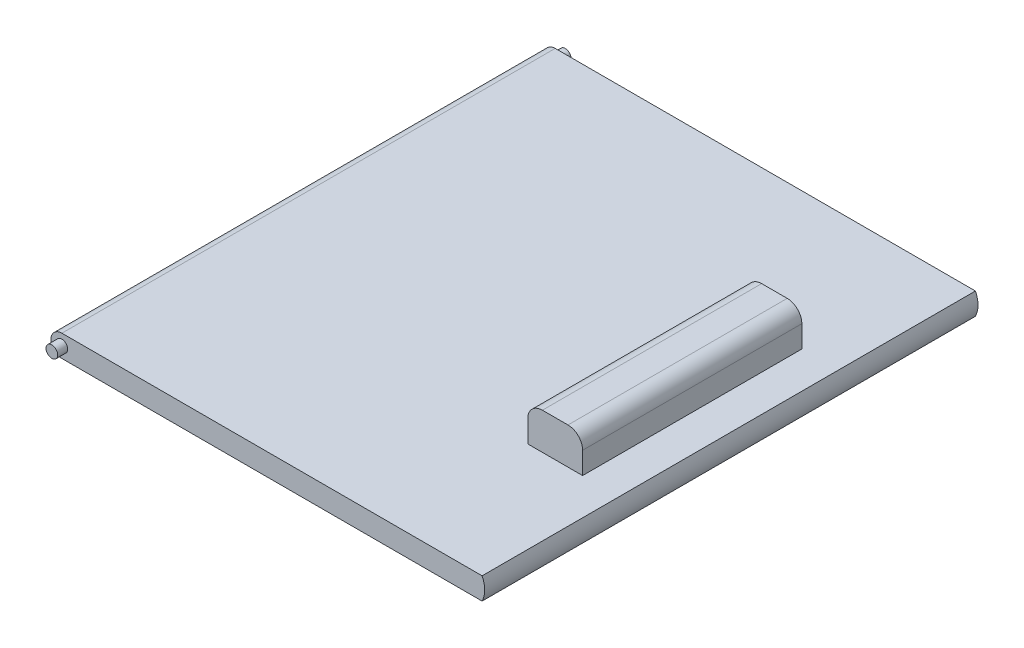
ISO-10303-21;
HEADER;
FILE_DESCRIPTION(('STEP AP214'),'2;1');
FILE_NAME('part.step','',(''),(''),'','','');
FILE_SCHEMA(('AUTOMOTIVE_DESIGN { 1 0 10303 214 1 1 1 1 }'));
ENDSEC;
DATA;
#1=APPLICATION_CONTEXT('core data for automotive mechanical design processes');
#2=APPLICATION_PROTOCOL_DEFINITION('international standard','automotive_design',2000,#1);
#3=PRODUCT_CONTEXT('',#1,'mechanical');
#4=PRODUCT('Part','Part','',(#3));
#5=PRODUCT_RELATED_PRODUCT_CATEGORY('part','',(#4));
#6=PRODUCT_DEFINITION_FORMATION('','',#4);
#7=PRODUCT_DEFINITION_CONTEXT('part definition',#1,'design');
#8=PRODUCT_DEFINITION('design','',#6,#7);
#9=PRODUCT_DEFINITION_SHAPE('','',#8);
#10=(LENGTH_UNIT() NAMED_UNIT(*) SI_UNIT(.MILLI.,.METRE.));
#11=(NAMED_UNIT(*) PLANE_ANGLE_UNIT() SI_UNIT($,.RADIAN.));
#12=(NAMED_UNIT(*) SI_UNIT($,.STERADIAN.) SOLID_ANGLE_UNIT());
#13=UNCERTAINTY_MEASURE_WITH_UNIT(LENGTH_MEASURE(1.E-05),#10,'distance_accuracy_value','');
#14=(GEOMETRIC_REPRESENTATION_CONTEXT(3) GLOBAL_UNCERTAINTY_ASSIGNED_CONTEXT((#13)) GLOBAL_UNIT_ASSIGNED_CONTEXT((#10,
#11,#12)) REPRESENTATION_CONTEXT('',''));
#15=CARTESIAN_POINT('',(0.,0.,0.));
#16=DIRECTION('',(0.,0.,1.));
#17=DIRECTION('',(1.,0.,0.));
#18=AXIS2_PLACEMENT_3D('',#15,#16,#17);
#19=CARTESIAN_POINT('',(0.,1.5,67.5));
#20=DIRECTION('',(0.,-1.,0.));
#21=DIRECTION('',(0.,0.,-1.));
#22=AXIS2_PLACEMENT_3D('',#19,#20,#21);
#23=PLANE('',#22);
#24=DIRECTION('',(-1.,0.,0.));
#25=VECTOR('',#24,1.);
#26=CARTESIAN_POINT('',(0.,1.5,0.));
#27=LINE('',#26,#25);
#28=CARTESIAN_POINT('',(57.5,1.49999999999999,0.));
#29=VERTEX_POINT('',#28);
#30=CARTESIAN_POINT('',(0.,1.5,0.));
#31=VERTEX_POINT('',#30);
#32=EDGE_CURVE('E159',#29,#31,#27,.T.);
#33=ORIENTED_EDGE('',*,*,#32,.T.);
#34=DIRECTION('',(0.,0.,-1.));
#35=VECTOR('',#34,1.);
#36=CARTESIAN_POINT('',(0.,1.5,67.5));
#37=LINE('',#36,#35);
#38=CARTESIAN_POINT('',(0.,1.5,67.5));
#39=VERTEX_POINT('',#38);
#40=EDGE_CURVE('E179',#39,#31,#37,.T.);
#41=ORIENTED_EDGE('',*,*,#40,.F.);
#42=DIRECTION('',(-1.,0.,0.));
#43=VECTOR('',#42,1.);
#44=CARTESIAN_POINT('',(0.,1.5,67.5));
#45=LINE('',#44,#43);
#46=CARTESIAN_POINT('',(57.5,1.5,67.5));
#47=VERTEX_POINT('',#46);
#48=EDGE_CURVE('E162',#47,#39,#45,.T.);
#49=ORIENTED_EDGE('',*,*,#48,.F.);
#50=DIRECTION('',(0.,0.,-1.));
#51=VECTOR('',#50,1.);
#52=CARTESIAN_POINT('',(57.5,1.5,67.5));
#53=LINE('',#52,#51);
#54=EDGE_CURVE('E182',#47,#29,#53,.T.);
#55=ORIENTED_EDGE('',*,*,#54,.T.);
#56=EDGE_LOOP('',(#33,#41,#49,#55));
#57=FACE_BOUND('',#56,.T.);
#58=DIRECTION('',(0.,0.,1.));
#59=VECTOR('',#58,1.);
#60=CARTESIAN_POINT('',(45.,1.5,18.75));
#61=LINE('',#60,#59);
#62=CARTESIAN_POINT('',(45.,1.5,18.75));
#63=VERTEX_POINT('',#62);
#64=CARTESIAN_POINT('',(45.,1.5,48.75));
#65=VERTEX_POINT('',#64);
#66=EDGE_CURVE('E117',#63,#65,#61,.T.);
#67=ORIENTED_EDGE('',*,*,#66,.F.);
#68=DIRECTION('',(-1.,0.,0.));
#69=VECTOR('',#68,1.);
#70=CARTESIAN_POINT('',(45.,1.5,18.75));
#71=LINE('',#70,#69);
#72=CARTESIAN_POINT('',(52.5,1.5,18.75));
#73=VERTEX_POINT('',#72);
#74=EDGE_CURVE('E127',#73,#63,#71,.T.);
#75=ORIENTED_EDGE('',*,*,#74,.F.);
#76=DIRECTION('',(0.,0.,-1.));
#77=VECTOR('',#76,1.);
#78=CARTESIAN_POINT('',(52.5,1.5,18.75));
#79=LINE('',#78,#77);
#80=CARTESIAN_POINT('',(52.5,1.5,48.75));
#81=VERTEX_POINT('',#80);
#82=EDGE_CURVE('E134',#81,#73,#79,.T.);
#83=ORIENTED_EDGE('',*,*,#82,.F.);
#84=DIRECTION('',(1.,0.,0.));
#85=VECTOR('',#84,1.);
#86=CARTESIAN_POINT('',(45.,1.5,48.75));
#87=LINE('',#86,#85);
#88=EDGE_CURVE('E130',#65,#81,#87,.T.);
#89=ORIENTED_EDGE('',*,*,#88,.F.);
#90=EDGE_LOOP('',(#67,#75,#83,#89));
#91=FACE_BOUND('',#90,.T.);
#92=ADVANCED_FACE('F39',(#57,#91),#23,.F.);
#93=CARTESIAN_POINT('',(0.,0.,67.5));
#94=DIRECTION('',(0.,0.,-1.));
#95=DIRECTION('',(-1.,0.,0.));
#96=AXIS2_PLACEMENT_3D('',#93,#94,#95);
#97=CYLINDRICAL_SURFACE('',#96,1.5);
#98=CARTESIAN_POINT('',(0.,0.,0.));
#99=DIRECTION('',(0.,0.,1.));
#100=DIRECTION('',(1.,0.,0.));
#101=AXIS2_PLACEMENT_3D('',#98,#99,#100);
#102=CIRCLE('',#101,1.5);
#103=CARTESIAN_POINT('',(0.,-1.5,0.));
#104=VERTEX_POINT('',#103);
#105=EDGE_CURVE('E171',#31,#104,#102,.T.);
#106=ORIENTED_EDGE('',*,*,#105,.T.);
#107=DIRECTION('',(0.,0.,-1.));
#108=VECTOR('',#107,1.);
#109=CARTESIAN_POINT('',(0.,-1.5,67.5));
#110=LINE('',#109,#108);
#111=CARTESIAN_POINT('',(0.,-1.5,67.5));
#112=VERTEX_POINT('',#111);
#113=EDGE_CURVE('E176',#112,#104,#110,.T.);
#114=ORIENTED_EDGE('',*,*,#113,.F.);
#115=CARTESIAN_POINT('',(0.,0.,67.5));
#116=DIRECTION('',(0.,0.,1.));
#117=DIRECTION('',(1.,0.,0.));
#118=AXIS2_PLACEMENT_3D('',#115,#116,#117);
#119=CIRCLE('',#118,1.5);
#120=EDGE_CURVE('E164',#39,#112,#119,.T.);
#121=ORIENTED_EDGE('',*,*,#120,.F.);
#122=ORIENTED_EDGE('',*,*,#40,.T.);
#123=EDGE_LOOP('',(#106,#114,#121,#122));
#124=FACE_BOUND('',#123,.T.);
#125=ADVANCED_FACE('F224',(#124),#97,.T.);
#126=CARTESIAN_POINT('',(0.,-1.5,67.5));
#127=DIRECTION('',(0.,1.,0.));
#128=DIRECTION('',(0.,0.,1.));
#129=AXIS2_PLACEMENT_3D('',#126,#127,#128);
#130=PLANE('',#129);
#131=DIRECTION('',(1.,0.,0.));
#132=VECTOR('',#131,1.);
#133=CARTESIAN_POINT('',(0.,-1.5,0.));
#134=LINE('',#133,#132);
#135=CARTESIAN_POINT('',(57.5,-1.5,0.));
#136=VERTEX_POINT('',#135);
#137=EDGE_CURVE('E165',#104,#136,#134,.T.);
#138=ORIENTED_EDGE('',*,*,#137,.T.);
#139=DIRECTION('',(0.,0.,-1.));
#140=VECTOR('',#139,1.);
#141=CARTESIAN_POINT('',(57.5,-1.5,67.5));
#142=LINE('',#141,#140);
#143=CARTESIAN_POINT('',(57.5,-1.5,67.5));
#144=VERTEX_POINT('',#143);
#145=EDGE_CURVE('E169',#144,#136,#142,.T.);
#146=ORIENTED_EDGE('',*,*,#145,.F.);
#147=DIRECTION('',(1.,0.,0.));
#148=VECTOR('',#147,1.);
#149=CARTESIAN_POINT('',(0.,-1.5,67.5));
#150=LINE('',#149,#148);
#151=EDGE_CURVE('E167',#112,#144,#150,.T.);
#152=ORIENTED_EDGE('',*,*,#151,.F.);
#153=ORIENTED_EDGE('',*,*,#113,.T.);
#154=EDGE_LOOP('',(#138,#146,#152,#153));
#155=FACE_BOUND('',#154,.T.);
#156=ADVANCED_FACE('F232',(#155),#130,.F.);
#157=CARTESIAN_POINT('',(0.,0.,67.5));
#158=DIRECTION('',(0.,0.,1.));
#159=DIRECTION('',(1.,0.,0.));
#160=AXIS2_PLACEMENT_3D('',#157,#158,#159);
#161=PLANE('',#160);
#162=CARTESIAN_POINT('',(0.,0.,67.5));
#163=DIRECTION('',(0.,0.,1.));
#164=DIRECTION('',(1.,0.,0.));
#165=AXIS2_PLACEMENT_3D('',#162,#163,#164);
#166=CIRCLE('',#165,0.8);
#167=CARTESIAN_POINT('',(0.8,0.,67.5));
#168=VERTEX_POINT('',#167);
#169=EDGE_CURVE('E155',#168,#168,#166,.T.);
#170=ORIENTED_EDGE('',*,*,#169,.F.);
#171=EDGE_LOOP('',(#170));
#172=FACE_BOUND('',#171,.T.);
#173=ORIENTED_EDGE('',*,*,#151,.T.);
#174=CARTESIAN_POINT('',(54.5,0.,67.5));
#175=DIRECTION('',(0.,0.,1.));
#176=DIRECTION('',(1.,0.,0.));
#177=AXIS2_PLACEMENT_3D('',#174,#175,#176);
#178=CIRCLE('',#177,3.35410196624968);
#179=EDGE_CURVE('E146',#144,#47,#178,.T.);
#180=ORIENTED_EDGE('',*,*,#179,.T.);
#181=ORIENTED_EDGE('',*,*,#48,.T.);
#182=ORIENTED_EDGE('',*,*,#120,.T.);
#183=EDGE_LOOP('',(#173,#180,#181,#182));
#184=FACE_BOUND('',#183,.T.);
#185=ADVANCED_FACE('F293',(#172,#184),#161,.T.);
#186=CARTESIAN_POINT('',(0.,0.,0.));
#187=DIRECTION('',(0.,0.,1.));
#188=DIRECTION('',(1.,0.,0.));
#189=AXIS2_PLACEMENT_3D('',#186,#187,#188);
#190=PLANE('',#189);
#191=CARTESIAN_POINT('',(0.,0.,0.));
#192=DIRECTION('',(0.,0.,1.));
#193=DIRECTION('',(1.,0.,0.));
#194=AXIS2_PLACEMENT_3D('',#191,#192,#193);
#195=CIRCLE('',#194,0.8);
#196=CARTESIAN_POINT('',(0.8,0.,0.));
#197=VERTEX_POINT('',#196);
#198=EDGE_CURVE('E184',#197,#197,#195,.F.);
#199=ORIENTED_EDGE('',*,*,#198,.F.);
#200=EDGE_LOOP('',(#199));
#201=FACE_BOUND('',#200,.T.);
#202=ORIENTED_EDGE('',*,*,#32,.F.);
#203=CARTESIAN_POINT('',(54.5,0.,0.));
#204=DIRECTION('',(0.,0.,1.));
#205=DIRECTION('',(1.,0.,0.));
#206=AXIS2_PLACEMENT_3D('',#203,#204,#205);
#207=CIRCLE('',#206,3.35410196624968);
#208=EDGE_CURVE('E147',#29,#136,#207,.F.);
#209=ORIENTED_EDGE('',*,*,#208,.T.);
#210=ORIENTED_EDGE('',*,*,#137,.F.);
#211=ORIENTED_EDGE('',*,*,#105,.F.);
#212=EDGE_LOOP('',(#202,#209,#210,#211));
#213=FACE_BOUND('',#212,.T.);
#214=ADVANCED_FACE('F287',(#201,#213),#190,.F.);
#215=CARTESIAN_POINT('',(0.,0.,68.875));
#216=DIRECTION('',(0.,0.,-1.));
#217=DIRECTION('',(-1.,0.,0.));
#218=AXIS2_PLACEMENT_3D('',#215,#216,#217);
#219=CYLINDRICAL_SURFACE('',#218,0.8);
#220=CARTESIAN_POINT('',(0.,0.,68.875));
#221=DIRECTION('',(0.,0.,1.));
#222=DIRECTION('',(1.,0.,0.));
#223=AXIS2_PLACEMENT_3D('',#220,#221,#222);
#224=CIRCLE('',#223,0.8);
#225=CARTESIAN_POINT('',(0.8,0.,68.875));
#226=VERTEX_POINT('',#225);
#227=EDGE_CURVE('E156',#226,#226,#224,.T.);
#228=ORIENTED_EDGE('',*,*,#227,.F.);
#229=EDGE_LOOP('',(#228));
#230=FACE_BOUND('',#229,.T.);
#231=ORIENTED_EDGE('',*,*,#169,.T.);
#232=EDGE_LOOP('',(#231));
#233=FACE_BOUND('',#232,.T.);
#234=ADVANCED_FACE('F292',(#230,#233),#219,.T.);
#235=CARTESIAN_POINT('',(0.,0.,68.875));
#236=DIRECTION('',(0.,0.,1.));
#237=DIRECTION('',(1.,0.,0.));
#238=AXIS2_PLACEMENT_3D('',#235,#236,#237);
#239=PLANE('',#238);
#240=ORIENTED_EDGE('',*,*,#227,.T.);
#241=EDGE_LOOP('',(#240));
#242=FACE_BOUND('',#241,.T.);
#243=ADVANCED_FACE('F328',(#242),#239,.T.);
#244=CARTESIAN_POINT('',(0.,0.,-1.375));
#245=DIRECTION('',(0.,0.,1.));
#246=DIRECTION('',(1.,0.,0.));
#247=AXIS2_PLACEMENT_3D('',#244,#245,#246);
#248=CYLINDRICAL_SURFACE('',#247,0.8);
#249=CARTESIAN_POINT('',(0.,0.,-1.375));
#250=DIRECTION('',(0.,0.,-1.));
#251=DIRECTION('',(-1.,0.,0.));
#252=AXIS2_PLACEMENT_3D('',#249,#250,#251);
#253=CIRCLE('',#252,0.8);
#254=CARTESIAN_POINT('',(-0.8,0.,-1.375));
#255=VERTEX_POINT('',#254);
#256=EDGE_CURVE('E150',#255,#255,#253,.T.);
#257=ORIENTED_EDGE('',*,*,#256,.F.);
#258=EDGE_LOOP('',(#257));
#259=FACE_BOUND('',#258,.T.);
#260=ORIENTED_EDGE('',*,*,#198,.T.);
#261=EDGE_LOOP('',(#260));
#262=FACE_BOUND('',#261,.T.);
#263=ADVANCED_FACE('F318',(#259,#262),#248,.T.);
#264=CARTESIAN_POINT('',(0.,0.,-1.375));
#265=DIRECTION('',(0.,0.,-1.));
#266=DIRECTION('',(-1.,0.,0.));
#267=AXIS2_PLACEMENT_3D('',#264,#265,#266);
#268=PLANE('',#267);
#269=ORIENTED_EDGE('',*,*,#256,.T.);
#270=EDGE_LOOP('',(#269));
#271=FACE_BOUND('',#270,.T.);
#272=ADVANCED_FACE('F280',(#271),#268,.T.);
#273=CARTESIAN_POINT('',(54.5,0.,-3.02082574845056));
#274=DIRECTION('',(0.,0.,1.));
#275=DIRECTION('',(1.,0.,0.));
#276=AXIS2_PLACEMENT_3D('',#273,#274,#275);
#277=CYLINDRICAL_SURFACE('',#276,3.35410196624968);
#278=ORIENTED_EDGE('',*,*,#208,.F.);
#279=ORIENTED_EDGE('',*,*,#54,.F.);
#280=ORIENTED_EDGE('',*,*,#179,.F.);
#281=ORIENTED_EDGE('',*,*,#145,.T.);
#282=EDGE_LOOP('',(#278,#279,#280,#281));
#283=FACE_BOUND('',#282,.T.);
#284=ADVANCED_FACE('F268',(#283),#277,.T.);
#285=CARTESIAN_POINT('',(45.,6.5,18.75));
#286=DIRECTION('',(1.,0.,0.));
#287=DIRECTION('',(0.,0.,-1.));
#288=AXIS2_PLACEMENT_3D('',#285,#286,#287);
#289=PLANE('',#288);
#290=DIRECTION('',(0.,-1.,0.));
#291=VECTOR('',#290,1.);
#292=CARTESIAN_POINT('',(45.,6.5,48.75));
#293=LINE('',#292,#291);
#294=CARTESIAN_POINT('',(45.,4.5,48.75));
#295=VERTEX_POINT('',#294);
#296=EDGE_CURVE('E144',#295,#65,#293,.T.);
#297=ORIENTED_EDGE('',*,*,#296,.F.);
#298=DIRECTION('',(0.,0.,1.));
#299=VECTOR('',#298,1.);
#300=CARTESIAN_POINT('',(45.,4.5,18.75));
#301=LINE('',#300,#299);
#302=CARTESIAN_POINT('',(45.,4.5,18.75));
#303=VERTEX_POINT('',#302);
#304=EDGE_CURVE('E62',#295,#303,#301,.F.);
#305=ORIENTED_EDGE('',*,*,#304,.T.);
#306=DIRECTION('',(0.,-1.,0.));
#307=VECTOR('',#306,1.);
#308=CARTESIAN_POINT('',(45.,6.5,18.75));
#309=LINE('',#308,#307);
#310=EDGE_CURVE('E114',#303,#63,#309,.T.);
#311=ORIENTED_EDGE('',*,*,#310,.T.);
#312=ORIENTED_EDGE('',*,*,#66,.T.);
#313=EDGE_LOOP('',(#297,#305,#311,#312));
#314=FACE_BOUND('',#313,.T.);
#315=ADVANCED_FACE('F116',(#314),#289,.F.);
#316=CARTESIAN_POINT('',(45.,6.5,48.75));
#317=DIRECTION('',(0.,0.,-1.));
#318=DIRECTION('',(-1.,0.,0.));
#319=AXIS2_PLACEMENT_3D('',#316,#317,#318);
#320=PLANE('',#319);
#321=DIRECTION('',(1.,0.,0.));
#322=VECTOR('',#321,1.);
#323=CARTESIAN_POINT('',(45.,6.5,48.75));
#324=LINE('',#323,#322);
#325=CARTESIAN_POINT('',(47.,6.5,48.75));
#326=VERTEX_POINT('',#325);
#327=CARTESIAN_POINT('',(50.5,6.5,48.75));
#328=VERTEX_POINT('',#327);
#329=EDGE_CURVE('E133',#326,#328,#324,.T.);
#330=ORIENTED_EDGE('',*,*,#329,.F.);
#331=CARTESIAN_POINT('',(47.,4.5,48.75));
#332=DIRECTION('',(0.,0.,-1.));
#333=DIRECTION('',(-1.,0.,0.));
#334=AXIS2_PLACEMENT_3D('',#331,#332,#333);
#335=CIRCLE('',#334,2.);
#336=EDGE_CURVE('E195',#326,#295,#335,.F.);
#337=ORIENTED_EDGE('',*,*,#336,.T.);
#338=ORIENTED_EDGE('',*,*,#296,.T.);
#339=ORIENTED_EDGE('',*,*,#88,.T.);
#340=DIRECTION('',(0.,-1.,0.));
#341=VECTOR('',#340,1.);
#342=CARTESIAN_POINT('',(52.5,6.5,48.75));
#343=LINE('',#342,#341);
#344=CARTESIAN_POINT('',(52.5,4.5,48.75));
#345=VERTEX_POINT('',#344);
#346=EDGE_CURVE('E142',#345,#81,#343,.T.);
#347=ORIENTED_EDGE('',*,*,#346,.F.);
#348=CARTESIAN_POINT('',(50.5,4.5,48.75));
#349=DIRECTION('',(0.,0.,-1.));
#350=DIRECTION('',(-1.,0.,0.));
#351=AXIS2_PLACEMENT_3D('',#348,#349,#350);
#352=CIRCLE('',#351,2.);
#353=EDGE_CURVE('E193',#345,#328,#352,.F.);
#354=ORIENTED_EDGE('',*,*,#353,.T.);
#355=EDGE_LOOP('',(#330,#337,#338,#339,#347,#354));
#356=FACE_BOUND('',#355,.T.);
#357=ADVANCED_FACE('F208',(#356),#320,.F.);
#358=CARTESIAN_POINT('',(52.5,6.5,18.75));
#359=DIRECTION('',(-1.,0.,0.));
#360=DIRECTION('',(0.,0.,1.));
#361=AXIS2_PLACEMENT_3D('',#358,#359,#360);
#362=PLANE('',#361);
#363=DIRECTION('',(0.,-1.,0.));
#364=VECTOR('',#363,1.);
#365=CARTESIAN_POINT('',(52.5,6.5,18.75));
#366=LINE('',#365,#364);
#367=CARTESIAN_POINT('',(52.5,4.5,18.75));
#368=VERTEX_POINT('',#367);
#369=EDGE_CURVE('E120',#368,#73,#366,.T.);
#370=ORIENTED_EDGE('',*,*,#369,.F.);
#371=DIRECTION('',(0.,0.,-1.));
#372=VECTOR('',#371,1.);
#373=CARTESIAN_POINT('',(52.5,4.5,48.75));
#374=LINE('',#373,#372);
#375=EDGE_CURVE('E11',#368,#345,#374,.F.);
#376=ORIENTED_EDGE('',*,*,#375,.T.);
#377=ORIENTED_EDGE('',*,*,#346,.T.);
#378=ORIENTED_EDGE('',*,*,#82,.T.);
#379=EDGE_LOOP('',(#370,#376,#377,#378));
#380=FACE_BOUND('',#379,.T.);
#381=ADVANCED_FACE('F214',(#380),#362,.F.);
#382=CARTESIAN_POINT('',(45.,6.5,18.75));
#383=DIRECTION('',(0.,0.,1.));
#384=DIRECTION('',(1.,0.,0.));
#385=AXIS2_PLACEMENT_3D('',#382,#383,#384);
#386=PLANE('',#385);
#387=ORIENTED_EDGE('',*,*,#310,.F.);
#388=CARTESIAN_POINT('',(47.,4.5,18.75));
#389=DIRECTION('',(0.,0.,1.));
#390=DIRECTION('',(1.,0.,0.));
#391=AXIS2_PLACEMENT_3D('',#388,#389,#390);
#392=CIRCLE('',#391,2.);
#393=CARTESIAN_POINT('',(47.,6.5,18.75));
#394=VERTEX_POINT('',#393);
#395=EDGE_CURVE('E47',#303,#394,#392,.F.);
#396=ORIENTED_EDGE('',*,*,#395,.T.);
#397=DIRECTION('',(-1.,0.,0.));
#398=VECTOR('',#397,1.);
#399=CARTESIAN_POINT('',(45.,6.5,18.75));
#400=LINE('',#399,#398);
#401=CARTESIAN_POINT('',(50.5,6.5,18.75));
#402=VERTEX_POINT('',#401);
#403=EDGE_CURVE('E121',#402,#394,#400,.T.);
#404=ORIENTED_EDGE('',*,*,#403,.F.);
#405=CARTESIAN_POINT('',(50.5,4.5,18.75));
#406=DIRECTION('',(0.,0.,1.));
#407=DIRECTION('',(1.,0.,0.));
#408=AXIS2_PLACEMENT_3D('',#405,#406,#407);
#409=CIRCLE('',#408,2.);
#410=EDGE_CURVE('E54',#402,#368,#409,.F.);
#411=ORIENTED_EDGE('',*,*,#410,.T.);
#412=ORIENTED_EDGE('',*,*,#369,.T.);
#413=ORIENTED_EDGE('',*,*,#74,.T.);
#414=EDGE_LOOP('',(#387,#396,#404,#411,#412,#413));
#415=FACE_BOUND('',#414,.T.);
#416=ADVANCED_FACE('F132',(#415),#386,.F.);
#417=CARTESIAN_POINT('',(0.,6.5,0.));
#418=DIRECTION('',(0.,1.,0.));
#419=DIRECTION('',(0.,0.,1.));
#420=AXIS2_PLACEMENT_3D('',#417,#418,#419);
#421=PLANE('',#420);
#422=ORIENTED_EDGE('',*,*,#403,.T.);
#423=DIRECTION('',(0.,0.,1.));
#424=VECTOR('',#423,1.);
#425=CARTESIAN_POINT('',(47.,6.5,48.75));
#426=LINE('',#425,#424);
#427=EDGE_CURVE('E190',#394,#326,#426,.T.);
#428=ORIENTED_EDGE('',*,*,#427,.T.);
#429=ORIENTED_EDGE('',*,*,#329,.T.);
#430=DIRECTION('',(0.,0.,-1.));
#431=VECTOR('',#430,1.);
#432=CARTESIAN_POINT('',(50.5,6.5,18.75));
#433=LINE('',#432,#431);
#434=EDGE_CURVE('E187',#328,#402,#433,.T.);
#435=ORIENTED_EDGE('',*,*,#434,.T.);
#436=EDGE_LOOP('',(#422,#428,#429,#435));
#437=FACE_BOUND('',#436,.T.);
#438=ADVANCED_FACE('F202',(#437),#421,.T.);
#439=CARTESIAN_POINT('',(47.,4.5,0.));
#440=DIRECTION('',(0.,0.,-1.));
#441=DIRECTION('',(-1.,0.,0.));
#442=AXIS2_PLACEMENT_3D('',#439,#440,#441);
#443=CYLINDRICAL_SURFACE('',#442,2.);
#444=ORIENTED_EDGE('',*,*,#395,.F.);
#445=ORIENTED_EDGE('',*,*,#304,.F.);
#446=ORIENTED_EDGE('',*,*,#336,.F.);
#447=ORIENTED_EDGE('',*,*,#427,.F.);
#448=EDGE_LOOP('',(#444,#445,#446,#447));
#449=FACE_BOUND('',#448,.T.);
#450=ADVANCED_FACE('F206',(#449),#443,.T.);
#451=CARTESIAN_POINT('',(50.5,4.5,0.));
#452=DIRECTION('',(0.,0.,1.));
#453=DIRECTION('',(1.,0.,0.));
#454=AXIS2_PLACEMENT_3D('',#451,#452,#453);
#455=CYLINDRICAL_SURFACE('',#454,2.);
#456=ORIENTED_EDGE('',*,*,#353,.F.);
#457=ORIENTED_EDGE('',*,*,#375,.F.);
#458=ORIENTED_EDGE('',*,*,#410,.F.);
#459=ORIENTED_EDGE('',*,*,#434,.F.);
#460=EDGE_LOOP('',(#456,#457,#458,#459));
#461=FACE_BOUND('',#460,.T.);
#462=ADVANCED_FACE('F41',(#461),#455,.T.);
#463=CLOSED_SHELL('',(#92,#125,#156,#185,#214,#234,#243,#263,#272,#284,#315,#357,#381,#416,#438,
#450,#462));
#464=MANIFOLD_SOLID_BREP('B2',#463);
#465=ADVANCED_BREP_SHAPE_REPRESENTATION('',(#18,#464),#14);
#466=SHAPE_DEFINITION_REPRESENTATION(#9,#465);
ENDSEC;
END-ISO-10303-21;
